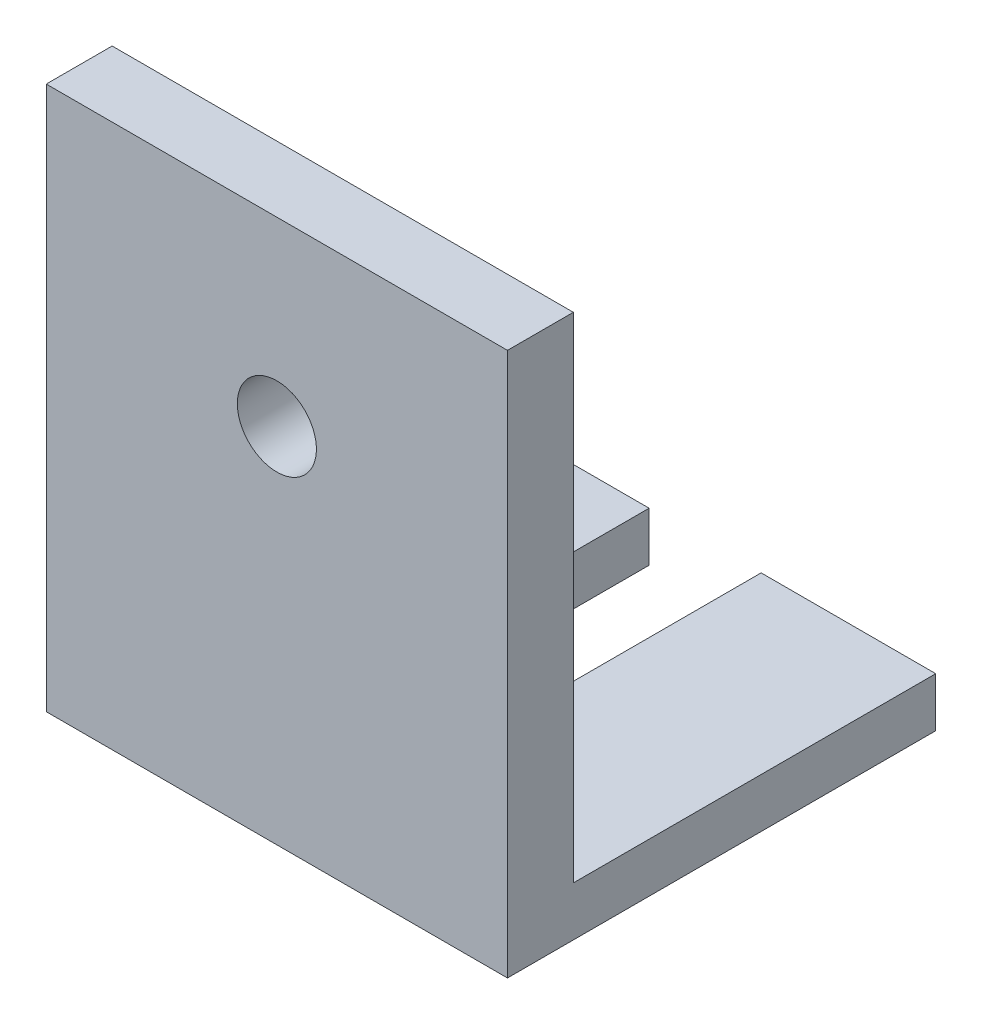
ISO-10303-21;
HEADER;
FILE_DESCRIPTION(('STEP AP214'),'2;1');
FILE_NAME('part.step','',(''),(''),'','','');
FILE_SCHEMA(('AUTOMOTIVE_DESIGN { 1 0 10303 214 1 1 1 1 }'));
ENDSEC;
DATA;
#1=APPLICATION_CONTEXT('core data for automotive mechanical design processes');
#2=APPLICATION_PROTOCOL_DEFINITION('international standard','automotive_design',2000,#1);
#3=PRODUCT_CONTEXT('',#1,'mechanical');
#4=PRODUCT('Part','Part','',(#3));
#5=PRODUCT_RELATED_PRODUCT_CATEGORY('part','',(#4));
#6=PRODUCT_DEFINITION_FORMATION('','',#4);
#7=PRODUCT_DEFINITION_CONTEXT('part definition',#1,'design');
#8=PRODUCT_DEFINITION('design','',#6,#7);
#9=PRODUCT_DEFINITION_SHAPE('','',#8);
#10=(LENGTH_UNIT() NAMED_UNIT(*) SI_UNIT(.MILLI.,.METRE.));
#11=(NAMED_UNIT(*) PLANE_ANGLE_UNIT() SI_UNIT($,.RADIAN.));
#12=(NAMED_UNIT(*) SI_UNIT($,.STERADIAN.) SOLID_ANGLE_UNIT());
#13=UNCERTAINTY_MEASURE_WITH_UNIT(LENGTH_MEASURE(1.E-05),#10,'distance_accuracy_value','');
#14=(GEOMETRIC_REPRESENTATION_CONTEXT(3) GLOBAL_UNCERTAINTY_ASSIGNED_CONTEXT((#13)) GLOBAL_UNIT_ASSIGNED_CONTEXT((#10,
#11,#12)) REPRESENTATION_CONTEXT('',''));
#15=CARTESIAN_POINT('',(0.,0.,0.));
#16=DIRECTION('',(0.,0.,1.));
#17=DIRECTION('',(1.,0.,0.));
#18=AXIS2_PLACEMENT_3D('',#15,#16,#17);
#19=CARTESIAN_POINT('',(0.,25.,0.));
#20=DIRECTION('',(0.,0.,1.));
#21=DIRECTION('',(1.,0.,0.));
#22=AXIS2_PLACEMENT_3D('',#19,#20,#21);
#23=PLANE('',#22);
#24=DIRECTION('',(-1.,0.,0.));
#25=VECTOR('',#24,1.);
#26=CARTESIAN_POINT('',(0.,-9.,0.));
#27=LINE('',#26,#25);
#28=CARTESIAN_POINT('',(10.6,-9.,0.));
#29=VERTEX_POINT('',#28);
#30=CARTESIAN_POINT('',(0.,-9.,0.));
#31=VERTEX_POINT('',#30);
#32=EDGE_CURVE('E130',#29,#31,#27,.T.);
#33=ORIENTED_EDGE('',*,*,#32,.F.);
#34=DIRECTION('',(0.,1.,0.));
#35=VECTOR('',#34,1.);
#36=CARTESIAN_POINT('',(10.6,0.,0.));
#37=LINE('',#36,#35);
#38=CARTESIAN_POINT('',(10.6,-12.,0.));
#39=VERTEX_POINT('',#38);
#40=EDGE_CURVE('E119',#39,#29,#37,.T.);
#41=ORIENTED_EDGE('',*,*,#40,.F.);
#42=DIRECTION('',(1.,0.,0.));
#43=VECTOR('',#42,1.);
#44=CARTESIAN_POINT('',(0.,-12.,0.));
#45=LINE('',#44,#43);
#46=CARTESIAN_POINT('',(0.,-12.,0.));
#47=VERTEX_POINT('',#46);
#48=EDGE_CURVE('E151',#47,#39,#45,.T.);
#49=ORIENTED_EDGE('',*,*,#48,.F.);
#50=DIRECTION('',(0.,-1.,0.));
#51=VECTOR('',#50,1.);
#52=CARTESIAN_POINT('',(0.,25.,0.));
#53=LINE('',#52,#51);
#54=EDGE_CURVE('E184',#31,#47,#53,.T.);
#55=ORIENTED_EDGE('',*,*,#54,.F.);
#56=EDGE_LOOP('',(#33,#41,#49,#55));
#57=FACE_BOUND('',#56,.T.);
#58=ADVANCED_FACE('F32',(#57),#23,.F.);
#59=CARTESIAN_POINT('',(28.,-9.,0.));
#60=VERTEX_POINT('',#59);
#61=CARTESIAN_POINT('',(17.4,-9.,0.));
#62=VERTEX_POINT('',#61);
#63=EDGE_CURVE('E54',#60,#62,#27,.T.);
#64=ORIENTED_EDGE('',*,*,#63,.F.);
#65=DIRECTION('',(0.,-1.,0.));
#66=VECTOR('',#65,1.);
#67=CARTESIAN_POINT('',(28.,25.,0.));
#68=LINE('',#67,#66);
#69=CARTESIAN_POINT('',(28.,-12.,0.));
#70=VERTEX_POINT('',#69);
#71=EDGE_CURVE('E40',#60,#70,#68,.T.);
#72=ORIENTED_EDGE('',*,*,#71,.T.);
#73=CARTESIAN_POINT('',(17.4,-12.,0.));
#74=VERTEX_POINT('',#73);
#75=EDGE_CURVE('E150',#74,#70,#45,.T.);
#76=ORIENTED_EDGE('',*,*,#75,.F.);
#77=DIRECTION('',(0.,1.,0.));
#78=VECTOR('',#77,1.);
#79=CARTESIAN_POINT('',(17.4,0.,0.));
#80=LINE('',#79,#78);
#81=EDGE_CURVE('E181',#74,#62,#80,.T.);
#82=ORIENTED_EDGE('',*,*,#81,.T.);
#83=EDGE_LOOP('',(#64,#72,#76,#82));
#84=FACE_BOUND('',#83,.T.);
#85=ADVANCED_FACE('F222',(#84),#23,.F.);
#86=CARTESIAN_POINT('',(10.6,0.,0.));
#87=DIRECTION('',(-1.,0.,0.));
#88=DIRECTION('',(0.,0.,1.));
#89=AXIS2_PLACEMENT_3D('',#86,#87,#88);
#90=PLANE('',#89);
#91=DIRECTION('',(0.,0.,-1.));
#92=VECTOR('',#91,1.);
#93=CARTESIAN_POINT('',(10.6,-9.,0.));
#94=LINE('',#93,#92);
#95=CARTESIAN_POINT('',(10.6,-9.,22.));
#96=VERTEX_POINT('',#95);
#97=EDGE_CURVE('E136',#96,#29,#94,.T.);
#98=ORIENTED_EDGE('',*,*,#97,.F.);
#99=DIRECTION('',(0.,1.,0.));
#100=VECTOR('',#99,1.);
#101=CARTESIAN_POINT('',(10.6,0.,22.));
#102=LINE('',#101,#100);
#103=CARTESIAN_POINT('',(10.6,-12.,22.));
#104=VERTEX_POINT('',#103);
#105=EDGE_CURVE('E124',#104,#96,#102,.T.);
#106=ORIENTED_EDGE('',*,*,#105,.F.);
#107=DIRECTION('',(0.,0.,1.));
#108=VECTOR('',#107,1.);
#109=CARTESIAN_POINT('',(10.6,-12.,0.));
#110=LINE('',#109,#108);
#111=EDGE_CURVE('E138',#39,#104,#110,.T.);
#112=ORIENTED_EDGE('',*,*,#111,.F.);
#113=ORIENTED_EDGE('',*,*,#40,.T.);
#114=EDGE_LOOP('',(#98,#106,#112,#113));
#115=FACE_BOUND('',#114,.T.);
#116=ADVANCED_FACE('F196',(#115),#90,.F.);
#117=CARTESIAN_POINT('',(17.4,0.,0.));
#118=DIRECTION('',(1.,0.,0.));
#119=DIRECTION('',(0.,0.,-1.));
#120=AXIS2_PLACEMENT_3D('',#117,#118,#119);
#121=PLANE('',#120);
#122=DIRECTION('',(0.,0.,1.));
#123=VECTOR('',#122,1.);
#124=CARTESIAN_POINT('',(17.4,-9.,0.));
#125=LINE('',#124,#123);
#126=CARTESIAN_POINT('',(17.4,-9.,22.));
#127=VERTEX_POINT('',#126);
#128=EDGE_CURVE('E11',#62,#127,#125,.T.);
#129=ORIENTED_EDGE('',*,*,#128,.F.);
#130=ORIENTED_EDGE('',*,*,#81,.F.);
#131=DIRECTION('',(0.,0.,-1.));
#132=VECTOR('',#131,1.);
#133=CARTESIAN_POINT('',(17.4,-12.,0.));
#134=LINE('',#133,#132);
#135=CARTESIAN_POINT('',(17.4,-12.,22.));
#136=VERTEX_POINT('',#135);
#137=EDGE_CURVE('E144',#136,#74,#134,.T.);
#138=ORIENTED_EDGE('',*,*,#137,.F.);
#139=DIRECTION('',(0.,1.,0.));
#140=VECTOR('',#139,1.);
#141=CARTESIAN_POINT('',(17.4,0.,22.));
#142=LINE('',#141,#140);
#143=EDGE_CURVE('E178',#136,#127,#142,.T.);
#144=ORIENTED_EDGE('',*,*,#143,.T.);
#145=EDGE_LOOP('',(#129,#130,#138,#144));
#146=FACE_BOUND('',#145,.T.);
#147=ADVANCED_FACE('F218',(#146),#121,.F.);
#148=CARTESIAN_POINT('',(0.,25.,0.));
#149=DIRECTION('',(1.,0.,0.));
#150=DIRECTION('',(0.,0.,-1.));
#151=AXIS2_PLACEMENT_3D('',#148,#149,#150);
#152=PLANE('',#151);
#153=DIRECTION('',(0.,1.,0.));
#154=VECTOR('',#153,1.);
#155=CARTESIAN_POINT('',(0.,3.,22.));
#156=LINE('',#155,#154);
#157=CARTESIAN_POINT('',(0.,-9.,22.));
#158=VERTEX_POINT('',#157);
#159=CARTESIAN_POINT('',(0.,21.,22.));
#160=VERTEX_POINT('',#159);
#161=EDGE_CURVE('E110',#158,#160,#156,.T.);
#162=ORIENTED_EDGE('',*,*,#161,.F.);
#163=DIRECTION('',(0.,0.,1.));
#164=VECTOR('',#163,1.);
#165=CARTESIAN_POINT('',(0.,-9.,0.));
#166=LINE('',#165,#164);
#167=EDGE_CURVE('E111',#31,#158,#166,.T.);
#168=ORIENTED_EDGE('',*,*,#167,.F.);
#169=ORIENTED_EDGE('',*,*,#54,.T.);
#170=DIRECTION('',(0.,0.,-1.));
#171=VECTOR('',#170,1.);
#172=CARTESIAN_POINT('',(0.,-12.,26.));
#173=LINE('',#172,#171);
#174=CARTESIAN_POINT('',(0.,-12.,26.));
#175=VERTEX_POINT('',#174);
#176=EDGE_CURVE('E147',#175,#47,#173,.T.);
#177=ORIENTED_EDGE('',*,*,#176,.F.);
#178=DIRECTION('',(0.,1.,0.));
#179=VECTOR('',#178,1.);
#180=CARTESIAN_POINT('',(0.,0.,26.));
#181=LINE('',#180,#179);
#182=CARTESIAN_POINT('',(0.,21.,26.));
#183=VERTEX_POINT('',#182);
#184=EDGE_CURVE('E161',#175,#183,#181,.T.);
#185=ORIENTED_EDGE('',*,*,#184,.T.);
#186=DIRECTION('',(0.,0.,1.));
#187=VECTOR('',#186,1.);
#188=CARTESIAN_POINT('',(0.,21.,28.));
#189=LINE('',#188,#187);
#190=EDGE_CURVE('E115',#160,#183,#189,.T.);
#191=ORIENTED_EDGE('',*,*,#190,.F.);
#192=EDGE_LOOP('',(#162,#168,#169,#177,#185,#191));
#193=FACE_BOUND('',#192,.T.);
#194=ADVANCED_FACE('F34',(#193),#152,.F.);
#195=CARTESIAN_POINT('',(28.,25.,0.));
#196=DIRECTION('',(-1.,0.,0.));
#197=DIRECTION('',(0.,0.,1.));
#198=AXIS2_PLACEMENT_3D('',#195,#196,#197);
#199=PLANE('',#198);
#200=DIRECTION('',(0.,0.,-1.));
#201=VECTOR('',#200,1.);
#202=CARTESIAN_POINT('',(28.,-9.,0.));
#203=LINE('',#202,#201);
#204=CARTESIAN_POINT('',(28.,-9.,22.));
#205=VERTEX_POINT('',#204);
#206=EDGE_CURVE('E125',#205,#60,#203,.T.);
#207=ORIENTED_EDGE('',*,*,#206,.F.);
#208=DIRECTION('',(0.,1.,0.));
#209=VECTOR('',#208,1.);
#210=CARTESIAN_POINT('',(28.,3.,22.));
#211=LINE('',#210,#209);
#212=CARTESIAN_POINT('',(28.,21.,22.));
#213=VERTEX_POINT('',#212);
#214=EDGE_CURVE('E118',#205,#213,#211,.T.);
#215=ORIENTED_EDGE('',*,*,#214,.T.);
#216=DIRECTION('',(0.,0.,-1.));
#217=VECTOR('',#216,1.);
#218=CARTESIAN_POINT('',(28.,21.,28.));
#219=LINE('',#218,#217);
#220=CARTESIAN_POINT('',(28.,21.,26.));
#221=VERTEX_POINT('',#220);
#222=EDGE_CURVE('E171',#221,#213,#219,.T.);
#223=ORIENTED_EDGE('',*,*,#222,.F.);
#224=DIRECTION('',(0.,1.,0.));
#225=VECTOR('',#224,1.);
#226=CARTESIAN_POINT('',(28.,0.,26.));
#227=LINE('',#226,#225);
#228=CARTESIAN_POINT('',(28.,-12.,26.));
#229=VERTEX_POINT('',#228);
#230=EDGE_CURVE('E160',#229,#221,#227,.T.);
#231=ORIENTED_EDGE('',*,*,#230,.F.);
#232=DIRECTION('',(0.,0.,1.));
#233=VECTOR('',#232,1.);
#234=CARTESIAN_POINT('',(28.,-12.,26.));
#235=LINE('',#234,#233);
#236=EDGE_CURVE('E154',#70,#229,#235,.T.);
#237=ORIENTED_EDGE('',*,*,#236,.F.);
#238=ORIENTED_EDGE('',*,*,#71,.F.);
#239=EDGE_LOOP('',(#207,#215,#223,#231,#237,#238));
#240=FACE_BOUND('',#239,.T.);
#241=ADVANCED_FACE('F213',(#240),#199,.F.);
#242=CARTESIAN_POINT('',(0.,3.,22.));
#243=DIRECTION('',(0.,0.,1.));
#244=DIRECTION('',(1.,0.,0.));
#245=AXIS2_PLACEMENT_3D('',#242,#243,#244);
#246=PLANE('',#245);
#247=CARTESIAN_POINT('',(14.,10.,22.));
#248=DIRECTION('',(0.,0.,-1.));
#249=DIRECTION('',(-1.,0.,0.));
#250=AXIS2_PLACEMENT_3D('',#247,#248,#249);
#251=CIRCLE('',#250,2.4);
#252=CARTESIAN_POINT('',(11.6,10.,22.));
#253=VERTEX_POINT('',#252);
#254=EDGE_CURVE('E175',#253,#253,#251,.T.);
#255=ORIENTED_EDGE('',*,*,#254,.F.);
#256=EDGE_LOOP('',(#255));
#257=FACE_BOUND('',#256,.T.);
#258=ORIENTED_EDGE('',*,*,#214,.F.);
#259=DIRECTION('',(1.,0.,0.));
#260=VECTOR('',#259,1.);
#261=CARTESIAN_POINT('',(0.,-9.,22.));
#262=LINE('',#261,#260);
#263=EDGE_CURVE('E126',#127,#205,#262,.T.);
#264=ORIENTED_EDGE('',*,*,#263,.F.);
#265=ORIENTED_EDGE('',*,*,#143,.F.);
#266=DIRECTION('',(1.,0.,0.));
#267=VECTOR('',#266,1.);
#268=CARTESIAN_POINT('',(10.6,-12.,22.));
#269=LINE('',#268,#267);
#270=EDGE_CURVE('E141',#104,#136,#269,.T.);
#271=ORIENTED_EDGE('',*,*,#270,.F.);
#272=ORIENTED_EDGE('',*,*,#105,.T.);
#273=EDGE_CURVE('E47',#158,#96,#262,.T.);
#274=ORIENTED_EDGE('',*,*,#273,.F.);
#275=ORIENTED_EDGE('',*,*,#161,.T.);
#276=DIRECTION('',(-1.,0.,0.));
#277=VECTOR('',#276,1.);
#278=CARTESIAN_POINT('',(0.,21.,22.));
#279=LINE('',#278,#277);
#280=EDGE_CURVE('E173',#213,#160,#279,.T.);
#281=ORIENTED_EDGE('',*,*,#280,.F.);
#282=EDGE_LOOP('',(#258,#264,#265,#271,#272,#274,#275,#281));
#283=FACE_BOUND('',#282,.T.);
#284=ADVANCED_FACE('F122',(#257,#283),#246,.F.);
#285=CARTESIAN_POINT('',(14.,10.,28.));
#286=DIRECTION('',(0.,0.,-1.));
#287=DIRECTION('',(-1.,0.,0.));
#288=AXIS2_PLACEMENT_3D('',#285,#286,#287);
#289=CYLINDRICAL_SURFACE('',#288,2.4);
#290=CARTESIAN_POINT('',(14.,10.,26.));
#291=DIRECTION('',(0.,0.,-1.));
#292=DIRECTION('',(-1.,0.,0.));
#293=AXIS2_PLACEMENT_3D('',#290,#291,#292);
#294=CIRCLE('',#293,2.4);
#295=CARTESIAN_POINT('',(11.6,10.,26.));
#296=VERTEX_POINT('',#295);
#297=EDGE_CURVE('E167',#296,#296,#294,.F.);
#298=ORIENTED_EDGE('',*,*,#297,.T.);
#299=EDGE_LOOP('',(#298));
#300=FACE_BOUND('',#299,.T.);
#301=ORIENTED_EDGE('',*,*,#254,.T.);
#302=EDGE_LOOP('',(#301));
#303=FACE_BOUND('',#302,.T.);
#304=ADVANCED_FACE('F236',(#300,#303),#289,.F.);
#305=CARTESIAN_POINT('',(0.,21.,0.));
#306=DIRECTION('',(0.,-1.,0.));
#307=DIRECTION('',(0.,0.,-1.));
#308=AXIS2_PLACEMENT_3D('',#305,#306,#307);
#309=PLANE('',#308);
#310=ORIENTED_EDGE('',*,*,#190,.T.);
#311=DIRECTION('',(1.,0.,0.));
#312=VECTOR('',#311,1.);
#313=CARTESIAN_POINT('',(0.,21.,26.));
#314=LINE('',#313,#312);
#315=EDGE_CURVE('E163',#183,#221,#314,.T.);
#316=ORIENTED_EDGE('',*,*,#315,.T.);
#317=ORIENTED_EDGE('',*,*,#222,.T.);
#318=ORIENTED_EDGE('',*,*,#280,.T.);
#319=EDGE_LOOP('',(#310,#316,#317,#318));
#320=FACE_BOUND('',#319,.T.);
#321=ADVANCED_FACE('F210',(#320),#309,.F.);
#322=CARTESIAN_POINT('',(0.,0.,26.));
#323=DIRECTION('',(0.,0.,-1.));
#324=DIRECTION('',(-1.,0.,0.));
#325=AXIS2_PLACEMENT_3D('',#322,#323,#324);
#326=PLANE('',#325);
#327=ORIENTED_EDGE('',*,*,#230,.T.);
#328=ORIENTED_EDGE('',*,*,#315,.F.);
#329=ORIENTED_EDGE('',*,*,#184,.F.);
#330=DIRECTION('',(-1.,0.,0.));
#331=VECTOR('',#330,1.);
#332=CARTESIAN_POINT('',(0.,-12.,26.));
#333=LINE('',#332,#331);
#334=EDGE_CURVE('E157',#229,#175,#333,.T.);
#335=ORIENTED_EDGE('',*,*,#334,.F.);
#336=EDGE_LOOP('',(#327,#328,#329,#335));
#337=FACE_BOUND('',#336,.T.);
#338=ORIENTED_EDGE('',*,*,#297,.F.);
#339=EDGE_LOOP('',(#338));
#340=FACE_BOUND('',#339,.T.);
#341=ADVANCED_FACE('F206',(#337,#340),#326,.F.);
#342=CARTESIAN_POINT('',(0.,-12.,0.));
#343=DIRECTION('',(0.,-1.,0.));
#344=DIRECTION('',(0.,0.,-1.));
#345=AXIS2_PLACEMENT_3D('',#342,#343,#344);
#346=PLANE('',#345);
#347=ORIENTED_EDGE('',*,*,#111,.T.);
#348=ORIENTED_EDGE('',*,*,#270,.T.);
#349=ORIENTED_EDGE('',*,*,#137,.T.);
#350=ORIENTED_EDGE('',*,*,#75,.T.);
#351=ORIENTED_EDGE('',*,*,#236,.T.);
#352=ORIENTED_EDGE('',*,*,#334,.T.);
#353=ORIENTED_EDGE('',*,*,#176,.T.);
#354=ORIENTED_EDGE('',*,*,#48,.T.);
#355=EDGE_LOOP('',(#347,#348,#349,#350,#351,#352,#353,#354));
#356=FACE_BOUND('',#355,.T.);
#357=ADVANCED_FACE('F201',(#356),#346,.T.);
#358=CARTESIAN_POINT('',(0.,-9.,0.));
#359=DIRECTION('',(0.,1.,0.));
#360=DIRECTION('',(0.,0.,1.));
#361=AXIS2_PLACEMENT_3D('',#358,#359,#360);
#362=PLANE('',#361);
#363=ORIENTED_EDGE('',*,*,#128,.T.);
#364=ORIENTED_EDGE('',*,*,#263,.T.);
#365=ORIENTED_EDGE('',*,*,#206,.T.);
#366=ORIENTED_EDGE('',*,*,#63,.T.);
#367=EDGE_LOOP('',(#363,#364,#365,#366));
#368=FACE_BOUND('',#367,.T.);
#369=ADVANCED_FACE('F216',(#368),#362,.T.);
#370=ORIENTED_EDGE('',*,*,#97,.T.);
#371=ORIENTED_EDGE('',*,*,#32,.T.);
#372=ORIENTED_EDGE('',*,*,#167,.T.);
#373=ORIENTED_EDGE('',*,*,#273,.T.);
#374=EDGE_LOOP('',(#370,#371,#372,#373));
#375=FACE_BOUND('',#374,.T.);
#376=ADVANCED_FACE('F128',(#375),#362,.T.);
#377=CLOSED_SHELL('',(#58,#85,#116,#147,#194,#241,#284,#304,#321,#341,#357,#369,#376));
#378=MANIFOLD_SOLID_BREP('B2',#377);
#379=ADVANCED_BREP_SHAPE_REPRESENTATION('',(#18,#378),#14);
#380=SHAPE_DEFINITION_REPRESENTATION(#9,#379);
ENDSEC;
END-ISO-10303-21;
